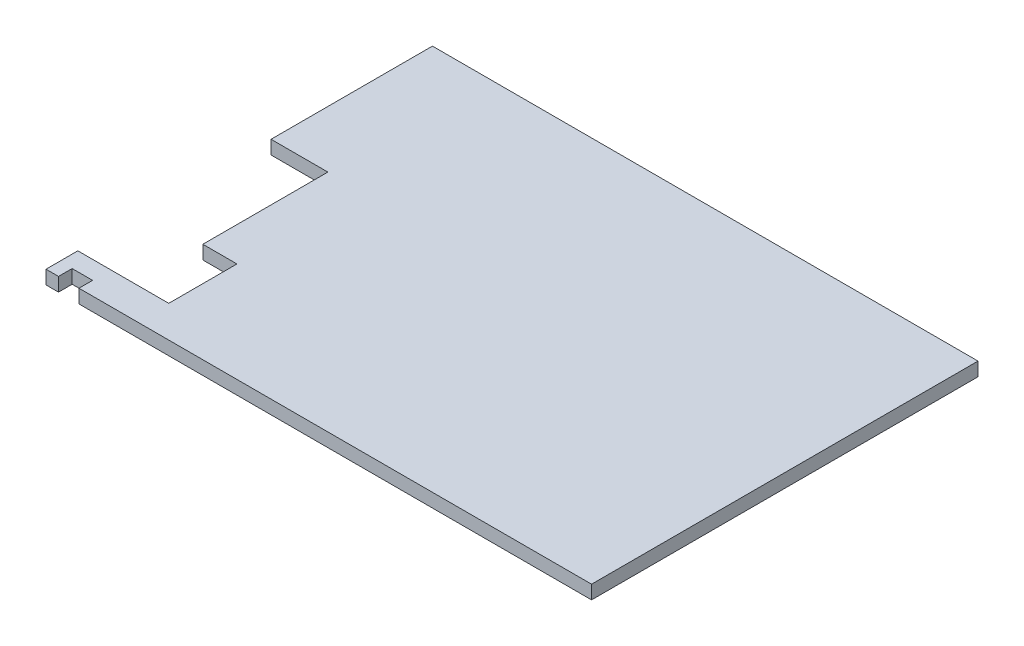
ISO-10303-21;
HEADER;
FILE_DESCRIPTION(('STEP AP214'),'2;1');
FILE_NAME('part.step','',(''),(''),'','','');
FILE_SCHEMA(('AUTOMOTIVE_DESIGN { 1 0 10303 214 1 1 1 1 }'));
ENDSEC;
DATA;
#1=APPLICATION_CONTEXT('core data for automotive mechanical design processes');
#2=APPLICATION_PROTOCOL_DEFINITION('international standard','automotive_design',2000,#1);
#3=PRODUCT_CONTEXT('',#1,'mechanical');
#4=PRODUCT('Part','Part','',(#3));
#5=PRODUCT_RELATED_PRODUCT_CATEGORY('part','',(#4));
#6=PRODUCT_DEFINITION_FORMATION('','',#4);
#7=PRODUCT_DEFINITION_CONTEXT('part definition',#1,'design');
#8=PRODUCT_DEFINITION('design','',#6,#7);
#9=PRODUCT_DEFINITION_SHAPE('','',#8);
#10=(LENGTH_UNIT() NAMED_UNIT(*) SI_UNIT(.MILLI.,.METRE.));
#11=(NAMED_UNIT(*) PLANE_ANGLE_UNIT() SI_UNIT($,.RADIAN.));
#12=(NAMED_UNIT(*) SI_UNIT($,.STERADIAN.) SOLID_ANGLE_UNIT());
#13=UNCERTAINTY_MEASURE_WITH_UNIT(LENGTH_MEASURE(1.E-05),#10,'distance_accuracy_value','');
#14=(GEOMETRIC_REPRESENTATION_CONTEXT(3) GLOBAL_UNCERTAINTY_ASSIGNED_CONTEXT((#13)) GLOBAL_UNIT_ASSIGNED_CONTEXT((#10,
#11,#12)) REPRESENTATION_CONTEXT('',''));
#15=CARTESIAN_POINT('',(0.,0.,0.));
#16=DIRECTION('',(0.,0.,1.));
#17=DIRECTION('',(1.,0.,0.));
#18=AXIS2_PLACEMENT_3D('',#15,#16,#17);
#19=CARTESIAN_POINT('',(40.,6.,-18.7966927474291));
#20=DIRECTION('',(1.,0.,0.));
#21=DIRECTION('',(0.,0.,-1.));
#22=AXIS2_PLACEMENT_3D('',#19,#20,#21);
#23=PLANE('',#22);
#24=DIRECTION('',(0.,0.,1.));
#25=VECTOR('',#24,1.);
#26=CARTESIAN_POINT('',(40.,0.,-18.7966927474291));
#27=LINE('',#26,#25);
#28=CARTESIAN_POINT('',(40.,0.,-48.7966927474291));
#29=VERTEX_POINT('',#28);
#30=CARTESIAN_POINT('',(40.,0.,-18.7966927474291));
#31=VERTEX_POINT('',#30);
#32=EDGE_CURVE('E165',#29,#31,#27,.T.);
#33=ORIENTED_EDGE('',*,*,#32,.T.);
#34=DIRECTION('',(0.,-1.,0.));
#35=VECTOR('',#34,1.);
#36=CARTESIAN_POINT('',(40.,6.,-18.7966927474291));
#37=LINE('',#36,#35);
#38=CARTESIAN_POINT('',(40.,6.,-18.7966927474291));
#39=VERTEX_POINT('',#38);
#40=EDGE_CURVE('E11',#39,#31,#37,.T.);
#41=ORIENTED_EDGE('',*,*,#40,.F.);
#42=DIRECTION('',(0.,0.,1.));
#43=VECTOR('',#42,1.);
#44=CARTESIAN_POINT('',(40.,6.,-18.7966927474291));
#45=LINE('',#44,#43);
#46=CARTESIAN_POINT('',(40.,6.,-48.7966927474291));
#47=VERTEX_POINT('',#46);
#48=EDGE_CURVE('E191',#47,#39,#45,.T.);
#49=ORIENTED_EDGE('',*,*,#48,.F.);
#50=DIRECTION('',(0.,-1.,0.));
#51=VECTOR('',#50,1.);
#52=CARTESIAN_POINT('',(40.,6.,-48.7966927474291));
#53=LINE('',#52,#51);
#54=EDGE_CURVE('E161',#47,#29,#53,.T.);
#55=ORIENTED_EDGE('',*,*,#54,.T.);
#56=EDGE_LOOP('',(#33,#41,#49,#55));
#57=FACE_BOUND('',#56,.T.);
#58=ADVANCED_FACE('F33',(#57),#23,.F.);
#59=CARTESIAN_POINT('',(0.,6.,-18.7966927474291));
#60=DIRECTION('',(0.,0.,1.));
#61=DIRECTION('',(1.,0.,0.));
#62=AXIS2_PLACEMENT_3D('',#59,#60,#61);
#63=PLANE('',#62);
#64=DIRECTION('',(-1.,0.,0.));
#65=VECTOR('',#64,1.);
#66=CARTESIAN_POINT('',(0.,0.,-18.7966927474291));
#67=LINE('',#66,#65);
#68=CARTESIAN_POINT('',(0.,0.,-18.7966927474291));
#69=VERTEX_POINT('',#68);
#70=EDGE_CURVE('E168',#31,#69,#67,.T.);
#71=ORIENTED_EDGE('',*,*,#70,.T.);
#72=DIRECTION('',(0.,-1.,0.));
#73=VECTOR('',#72,1.);
#74=CARTESIAN_POINT('',(0.,6.,-18.7966927474291));
#75=LINE('',#74,#73);
#76=CARTESIAN_POINT('',(0.,6.,-18.7966927474291));
#77=VERTEX_POINT('',#76);
#78=EDGE_CURVE('E41',#77,#69,#75,.T.);
#79=ORIENTED_EDGE('',*,*,#78,.F.);
#80=DIRECTION('',(-1.,0.,0.));
#81=VECTOR('',#80,1.);
#82=CARTESIAN_POINT('',(25.,6.,-18.7966927474291));
#83=LINE('',#82,#81);
#84=EDGE_CURVE('E110',#39,#77,#83,.T.);
#85=ORIENTED_EDGE('',*,*,#84,.F.);
#86=ORIENTED_EDGE('',*,*,#40,.T.);
#87=EDGE_LOOP('',(#71,#79,#85,#86));
#88=FACE_BOUND('',#87,.T.);
#89=ADVANCED_FACE('F279',(#88),#63,.F.);
#90=CARTESIAN_POINT('',(0.,6.,-4.79669274742912));
#91=DIRECTION('',(1.,0.,0.));
#92=DIRECTION('',(0.,0.,-1.));
#93=AXIS2_PLACEMENT_3D('',#90,#91,#92);
#94=PLANE('',#93);
#95=DIRECTION('',(0.,0.,1.));
#96=VECTOR('',#95,1.);
#97=CARTESIAN_POINT('',(0.,0.,-4.79669274742912));
#98=LINE('',#97,#96);
#99=CARTESIAN_POINT('',(0.,0.,-4.79669274742912));
#100=VERTEX_POINT('',#99);
#101=EDGE_CURVE('E170',#69,#100,#98,.T.);
#102=ORIENTED_EDGE('',*,*,#101,.T.);
#103=DIRECTION('',(0.,-1.,0.));
#104=VECTOR('',#103,1.);
#105=CARTESIAN_POINT('',(0.,6.,-4.79669274742912));
#106=LINE('',#105,#104);
#107=CARTESIAN_POINT('',(0.,6.,-4.79669274742912));
#108=VERTEX_POINT('',#107);
#109=EDGE_CURVE('E216',#108,#100,#106,.T.);
#110=ORIENTED_EDGE('',*,*,#109,.F.);
#111=DIRECTION('',(0.,0.,1.));
#112=VECTOR('',#111,1.);
#113=CARTESIAN_POINT('',(0.,6.,-4.79669274742912));
#114=LINE('',#113,#112);
#115=EDGE_CURVE('E224',#77,#108,#114,.T.);
#116=ORIENTED_EDGE('',*,*,#115,.F.);
#117=ORIENTED_EDGE('',*,*,#78,.T.);
#118=EDGE_LOOP('',(#102,#110,#116,#117));
#119=FACE_BOUND('',#118,.T.);
#120=ADVANCED_FACE('F222',(#119),#94,.F.);
#121=CARTESIAN_POINT('',(0.,6.,-4.79669274742912));
#122=DIRECTION('',(0.,0.,-1.));
#123=DIRECTION('',(-1.,0.,0.));
#124=AXIS2_PLACEMENT_3D('',#121,#122,#123);
#125=PLANE('',#124);
#126=DIRECTION('',(1.,0.,0.));
#127=VECTOR('',#126,1.);
#128=CARTESIAN_POINT('',(0.,0.,-4.79669274742912));
#129=LINE('',#128,#127);
#130=CARTESIAN_POINT('',(5.50000000000002,0.,-4.79669274742912));
#131=VERTEX_POINT('',#130);
#132=EDGE_CURVE('E172',#100,#131,#129,.T.);
#133=ORIENTED_EDGE('',*,*,#132,.T.);
#134=DIRECTION('',(0.,-1.,0.));
#135=VECTOR('',#134,1.);
#136=CARTESIAN_POINT('',(5.50000000000002,6.,-4.79669274742912));
#137=LINE('',#136,#135);
#138=CARTESIAN_POINT('',(5.50000000000002,6.,-4.79669274742912));
#139=VERTEX_POINT('',#138);
#140=EDGE_CURVE('E213',#139,#131,#137,.T.);
#141=ORIENTED_EDGE('',*,*,#140,.F.);
#142=DIRECTION('',(1.,0.,0.));
#143=VECTOR('',#142,1.);
#144=CARTESIAN_POINT('',(0.,6.,-4.79669274742912));
#145=LINE('',#144,#143);
#146=EDGE_CURVE('E242',#108,#139,#145,.T.);
#147=ORIENTED_EDGE('',*,*,#146,.F.);
#148=ORIENTED_EDGE('',*,*,#109,.T.);
#149=EDGE_LOOP('',(#133,#141,#147,#148));
#150=FACE_BOUND('',#149,.T.);
#151=ADVANCED_FACE('F233',(#150),#125,.F.);
#152=CARTESIAN_POINT('',(5.50000000000002,6.,-4.79669274742912));
#153=DIRECTION('',(-1.,0.,0.));
#154=DIRECTION('',(0.,0.,1.));
#155=AXIS2_PLACEMENT_3D('',#152,#153,#154);
#156=PLANE('',#155);
#157=DIRECTION('',(0.,0.,-1.));
#158=VECTOR('',#157,1.);
#159=CARTESIAN_POINT('',(5.50000000000002,0.,-4.79669274742912));
#160=LINE('',#159,#158);
#161=CARTESIAN_POINT('',(5.50000000000002,0.,-10.7966927474291));
#162=VERTEX_POINT('',#161);
#163=EDGE_CURVE('E174',#131,#162,#160,.T.);
#164=ORIENTED_EDGE('',*,*,#163,.T.);
#165=DIRECTION('',(0.,-1.,0.));
#166=VECTOR('',#165,1.);
#167=CARTESIAN_POINT('',(5.50000000000002,6.,-10.7966927474291));
#168=LINE('',#167,#166);
#169=CARTESIAN_POINT('',(5.50000000000002,6.,-10.7966927474291));
#170=VERTEX_POINT('',#169);
#171=EDGE_CURVE('E210',#170,#162,#168,.T.);
#172=ORIENTED_EDGE('',*,*,#171,.F.);
#173=DIRECTION('',(0.,0.,-1.));
#174=VECTOR('',#173,1.);
#175=CARTESIAN_POINT('',(5.50000000000002,6.,-4.79669274742912));
#176=LINE('',#175,#174);
#177=EDGE_CURVE('E239',#139,#170,#176,.T.);
#178=ORIENTED_EDGE('',*,*,#177,.F.);
#179=ORIENTED_EDGE('',*,*,#140,.T.);
#180=EDGE_LOOP('',(#164,#172,#178,#179));
#181=FACE_BOUND('',#180,.T.);
#182=ADVANCED_FACE('F237',(#181),#156,.F.);
#183=CARTESIAN_POINT('',(5.50000000000002,6.,-10.7966927474291));
#184=DIRECTION('',(0.,0.,-1.));
#185=DIRECTION('',(-1.,0.,0.));
#186=AXIS2_PLACEMENT_3D('',#183,#184,#185);
#187=PLANE('',#186);
#188=DIRECTION('',(1.,0.,0.));
#189=VECTOR('',#188,1.);
#190=CARTESIAN_POINT('',(5.50000000000002,0.,-10.7966927474291));
#191=LINE('',#190,#189);
#192=CARTESIAN_POINT('',(14.5,0.,-10.7966927474291));
#193=VERTEX_POINT('',#192);
#194=EDGE_CURVE('E176',#162,#193,#191,.T.);
#195=ORIENTED_EDGE('',*,*,#194,.T.);
#196=DIRECTION('',(0.,-1.,0.));
#197=VECTOR('',#196,1.);
#198=CARTESIAN_POINT('',(14.5,6.,-10.7966927474291));
#199=LINE('',#198,#197);
#200=CARTESIAN_POINT('',(14.5,6.,-10.7966927474291));
#201=VERTEX_POINT('',#200);
#202=EDGE_CURVE('E207',#201,#193,#199,.T.);
#203=ORIENTED_EDGE('',*,*,#202,.F.);
#204=DIRECTION('',(1.,0.,0.));
#205=VECTOR('',#204,1.);
#206=CARTESIAN_POINT('',(5.50000000000002,6.,-10.7966927474291));
#207=LINE('',#206,#205);
#208=EDGE_CURVE('E241',#170,#201,#207,.T.);
#209=ORIENTED_EDGE('',*,*,#208,.F.);
#210=ORIENTED_EDGE('',*,*,#171,.T.);
#211=EDGE_LOOP('',(#195,#203,#209,#210));
#212=FACE_BOUND('',#211,.T.);
#213=ADVANCED_FACE('F292',(#212),#187,.F.);
#214=CARTESIAN_POINT('',(14.5,6.,-4.79669274742912));
#215=DIRECTION('',(1.,0.,0.));
#216=DIRECTION('',(0.,0.,-1.));
#217=AXIS2_PLACEMENT_3D('',#214,#215,#216);
#218=PLANE('',#217);
#219=DIRECTION('',(0.,0.,1.));
#220=VECTOR('',#219,1.);
#221=CARTESIAN_POINT('',(14.5,0.,-4.79669274742912));
#222=LINE('',#221,#220);
#223=CARTESIAN_POINT('',(14.5,0.,-4.79669274742912));
#224=VERTEX_POINT('',#223);
#225=EDGE_CURVE('E178',#193,#224,#222,.T.);
#226=ORIENTED_EDGE('',*,*,#225,.T.);
#227=DIRECTION('',(0.,-1.,0.));
#228=VECTOR('',#227,1.);
#229=CARTESIAN_POINT('',(14.5,6.,-4.79669274742912));
#230=LINE('',#229,#228);
#231=CARTESIAN_POINT('',(14.5,6.,-4.79669274742912));
#232=VERTEX_POINT('',#231);
#233=EDGE_CURVE('E204',#232,#224,#230,.T.);
#234=ORIENTED_EDGE('',*,*,#233,.F.);
#235=DIRECTION('',(0.,0.,1.));
#236=VECTOR('',#235,1.);
#237=CARTESIAN_POINT('',(14.5,6.,-4.79669274742912));
#238=LINE('',#237,#236);
#239=EDGE_CURVE('E244',#201,#232,#238,.T.);
#240=ORIENTED_EDGE('',*,*,#239,.F.);
#241=ORIENTED_EDGE('',*,*,#202,.T.);
#242=EDGE_LOOP('',(#226,#234,#240,#241));
#243=FACE_BOUND('',#242,.T.);
#244=ADVANCED_FACE('F295',(#243),#218,.F.);
#245=CARTESIAN_POINT('',(14.5,6.,-4.79669274742912));
#246=DIRECTION('',(0.,0.,-1.));
#247=DIRECTION('',(-1.,0.,0.));
#248=AXIS2_PLACEMENT_3D('',#245,#246,#247);
#249=PLANE('',#248);
#250=DIRECTION('',(1.,0.,0.));
#251=VECTOR('',#250,1.);
#252=CARTESIAN_POINT('',(14.5,0.,-4.79669274742912));
#253=LINE('',#252,#251);
#254=CARTESIAN_POINT('',(240.,0.,-4.79669274742912));
#255=VERTEX_POINT('',#254);
#256=EDGE_CURVE('E180',#224,#255,#253,.T.);
#257=ORIENTED_EDGE('',*,*,#256,.T.);
#258=DIRECTION('',(0.,-1.,0.));
#259=VECTOR('',#258,1.);
#260=CARTESIAN_POINT('',(240.,6.,-4.79669274742912));
#261=LINE('',#260,#259);
#262=CARTESIAN_POINT('',(240.,6.,-4.79669274742912));
#263=VERTEX_POINT('',#262);
#264=EDGE_CURVE('E201',#263,#255,#261,.T.);
#265=ORIENTED_EDGE('',*,*,#264,.F.);
#266=DIRECTION('',(1.,0.,0.));
#267=VECTOR('',#266,1.);
#268=CARTESIAN_POINT('',(14.5,6.,-4.79669274742912));
#269=LINE('',#268,#267);
#270=EDGE_CURVE('E250',#232,#263,#269,.T.);
#271=ORIENTED_EDGE('',*,*,#270,.F.);
#272=ORIENTED_EDGE('',*,*,#233,.T.);
#273=EDGE_LOOP('',(#257,#265,#271,#272));
#274=FACE_BOUND('',#273,.T.);
#275=ADVANCED_FACE('F299',(#274),#249,.F.);
#276=CARTESIAN_POINT('',(240.,6.,-4.79669274742912));
#277=DIRECTION('',(-1.,0.,0.));
#278=DIRECTION('',(0.,0.,1.));
#279=AXIS2_PLACEMENT_3D('',#276,#277,#278);
#280=PLANE('',#279);
#281=DIRECTION('',(0.,0.,-1.));
#282=VECTOR('',#281,1.);
#283=CARTESIAN_POINT('',(240.,0.,-4.79669274742912));
#284=LINE('',#283,#282);
#285=CARTESIAN_POINT('',(240.,0.,-174.796692747429));
#286=VERTEX_POINT('',#285);
#287=EDGE_CURVE('E182',#255,#286,#284,.T.);
#288=ORIENTED_EDGE('',*,*,#287,.T.);
#289=DIRECTION('',(0.,-1.,0.));
#290=VECTOR('',#289,1.);
#291=CARTESIAN_POINT('',(240.,6.,-174.796692747429));
#292=LINE('',#291,#290);
#293=CARTESIAN_POINT('',(240.,6.,-174.796692747429));
#294=VERTEX_POINT('',#293);
#295=EDGE_CURVE('E198',#294,#286,#292,.T.);
#296=ORIENTED_EDGE('',*,*,#295,.F.);
#297=DIRECTION('',(0.,0.,-1.));
#298=VECTOR('',#297,1.);
#299=CARTESIAN_POINT('',(240.,6.,-4.79669274742912));
#300=LINE('',#299,#298);
#301=EDGE_CURVE('E252',#263,#294,#300,.T.);
#302=ORIENTED_EDGE('',*,*,#301,.F.);
#303=ORIENTED_EDGE('',*,*,#264,.T.);
#304=EDGE_LOOP('',(#288,#296,#302,#303));
#305=FACE_BOUND('',#304,.T.);
#306=ADVANCED_FACE('F303',(#305),#280,.F.);
#307=CARTESIAN_POINT('',(0.,6.,-174.796692747429));
#308=DIRECTION('',(0.,0.,1.));
#309=DIRECTION('',(1.,0.,0.));
#310=AXIS2_PLACEMENT_3D('',#307,#308,#309);
#311=PLANE('',#310);
#312=DIRECTION('',(-1.,0.,0.));
#313=VECTOR('',#312,1.);
#314=CARTESIAN_POINT('',(0.,0.,-174.796692747429));
#315=LINE('',#314,#313);
#316=CARTESIAN_POINT('',(0.,0.,-174.796692747429));
#317=VERTEX_POINT('',#316);
#318=EDGE_CURVE('E184',#286,#317,#315,.T.);
#319=ORIENTED_EDGE('',*,*,#318,.T.);
#320=DIRECTION('',(0.,-1.,0.));
#321=VECTOR('',#320,1.);
#322=CARTESIAN_POINT('',(0.,6.,-174.796692747429));
#323=LINE('',#322,#321);
#324=CARTESIAN_POINT('',(0.,6.,-174.796692747429));
#325=VERTEX_POINT('',#324);
#326=EDGE_CURVE('E195',#325,#317,#323,.T.);
#327=ORIENTED_EDGE('',*,*,#326,.F.);
#328=DIRECTION('',(-1.,0.,0.));
#329=VECTOR('',#328,1.);
#330=CARTESIAN_POINT('',(0.,6.,-174.796692747429));
#331=LINE('',#330,#329);
#332=EDGE_CURVE('E254',#294,#325,#331,.T.);
#333=ORIENTED_EDGE('',*,*,#332,.F.);
#334=ORIENTED_EDGE('',*,*,#295,.T.);
#335=EDGE_LOOP('',(#319,#327,#333,#334));
#336=FACE_BOUND('',#335,.T.);
#337=ADVANCED_FACE('F260',(#336),#311,.F.);
#338=CARTESIAN_POINT('',(0.,6.,-103.796692747429));
#339=DIRECTION('',(1.,0.,0.));
#340=DIRECTION('',(0.,0.,-1.));
#341=AXIS2_PLACEMENT_3D('',#338,#339,#340);
#342=PLANE('',#341);
#343=DIRECTION('',(0.,0.,1.));
#344=VECTOR('',#343,1.);
#345=CARTESIAN_POINT('',(0.,0.,-103.796692747429));
#346=LINE('',#345,#344);
#347=CARTESIAN_POINT('',(0.,0.,-103.796692747429));
#348=VERTEX_POINT('',#347);
#349=EDGE_CURVE('E186',#317,#348,#346,.T.);
#350=ORIENTED_EDGE('',*,*,#349,.T.);
#351=DIRECTION('',(0.,-1.,0.));
#352=VECTOR('',#351,1.);
#353=CARTESIAN_POINT('',(0.,6.,-103.796692747429));
#354=LINE('',#353,#352);
#355=CARTESIAN_POINT('',(0.,6.,-103.796692747429));
#356=VERTEX_POINT('',#355);
#357=EDGE_CURVE('E156',#356,#348,#354,.T.);
#358=ORIENTED_EDGE('',*,*,#357,.F.);
#359=DIRECTION('',(0.,0.,1.));
#360=VECTOR('',#359,1.);
#361=CARTESIAN_POINT('',(0.,6.,-103.796692747429));
#362=LINE('',#361,#360);
#363=EDGE_CURVE('E147',#325,#356,#362,.T.);
#364=ORIENTED_EDGE('',*,*,#363,.F.);
#365=ORIENTED_EDGE('',*,*,#326,.T.);
#366=EDGE_LOOP('',(#350,#358,#364,#365));
#367=FACE_BOUND('',#366,.T.);
#368=ADVANCED_FACE('F264',(#367),#342,.F.);
#369=CARTESIAN_POINT('',(25.,6.,-103.796692747429));
#370=DIRECTION('',(0.,0.,-1.));
#371=DIRECTION('',(-1.,0.,0.));
#372=AXIS2_PLACEMENT_3D('',#369,#370,#371);
#373=PLANE('',#372);
#374=DIRECTION('',(1.,0.,0.));
#375=VECTOR('',#374,1.);
#376=CARTESIAN_POINT('',(25.,0.,-103.796692747429));
#377=LINE('',#376,#375);
#378=CARTESIAN_POINT('',(25.,0.,-103.796692747429));
#379=VERTEX_POINT('',#378);
#380=EDGE_CURVE('E155',#348,#379,#377,.T.);
#381=ORIENTED_EDGE('',*,*,#380,.T.);
#382=DIRECTION('',(0.,-1.,0.));
#383=VECTOR('',#382,1.);
#384=CARTESIAN_POINT('',(25.,6.,-103.796692747429));
#385=LINE('',#384,#383);
#386=CARTESIAN_POINT('',(25.,6.,-103.796692747429));
#387=VERTEX_POINT('',#386);
#388=EDGE_CURVE('E152',#387,#379,#385,.T.);
#389=ORIENTED_EDGE('',*,*,#388,.F.);
#390=DIRECTION('',(1.,0.,0.));
#391=VECTOR('',#390,1.);
#392=CARTESIAN_POINT('',(25.,6.,-103.796692747429));
#393=LINE('',#392,#391);
#394=EDGE_CURVE('E141',#356,#387,#393,.T.);
#395=ORIENTED_EDGE('',*,*,#394,.F.);
#396=ORIENTED_EDGE('',*,*,#357,.T.);
#397=EDGE_LOOP('',(#381,#389,#395,#396));
#398=FACE_BOUND('',#397,.T.);
#399=ADVANCED_FACE('F153',(#398),#373,.F.);
#400=CARTESIAN_POINT('',(25.,6.,-48.7966927474291));
#401=DIRECTION('',(1.,0.,0.));
#402=DIRECTION('',(0.,0.,-1.));
#403=AXIS2_PLACEMENT_3D('',#400,#401,#402);
#404=PLANE('',#403);
#405=DIRECTION('',(0.,0.,1.));
#406=VECTOR('',#405,1.);
#407=CARTESIAN_POINT('',(25.,0.,-48.7966927474291));
#408=LINE('',#407,#406);
#409=CARTESIAN_POINT('',(25.,0.,-48.7966927474291));
#410=VERTEX_POINT('',#409);
#411=EDGE_CURVE('E96',#379,#410,#408,.T.);
#412=ORIENTED_EDGE('',*,*,#411,.T.);
#413=DIRECTION('',(0.,-1.,0.));
#414=VECTOR('',#413,1.);
#415=CARTESIAN_POINT('',(25.,6.,-48.7966927474291));
#416=LINE('',#415,#414);
#417=CARTESIAN_POINT('',(25.,6.,-48.7966927474291));
#418=VERTEX_POINT('',#417);
#419=EDGE_CURVE('E157',#418,#410,#416,.T.);
#420=ORIENTED_EDGE('',*,*,#419,.F.);
#421=DIRECTION('',(0.,0.,1.));
#422=VECTOR('',#421,1.);
#423=CARTESIAN_POINT('',(25.,6.,-48.7966927474291));
#424=LINE('',#423,#422);
#425=EDGE_CURVE('E145',#387,#418,#424,.T.);
#426=ORIENTED_EDGE('',*,*,#425,.F.);
#427=ORIENTED_EDGE('',*,*,#388,.T.);
#428=EDGE_LOOP('',(#412,#420,#426,#427));
#429=FACE_BOUND('',#428,.T.);
#430=ADVANCED_FACE('F159',(#429),#404,.F.);
#431=CARTESIAN_POINT('',(40.,6.,-48.7966927474291));
#432=DIRECTION('',(0.,0.,-1.));
#433=DIRECTION('',(-1.,0.,0.));
#434=AXIS2_PLACEMENT_3D('',#431,#432,#433);
#435=PLANE('',#434);
#436=DIRECTION('',(1.,0.,0.));
#437=VECTOR('',#436,1.);
#438=CARTESIAN_POINT('',(40.,0.,-48.7966927474291));
#439=LINE('',#438,#437);
#440=EDGE_CURVE('E102',#410,#29,#439,.T.);
#441=ORIENTED_EDGE('',*,*,#440,.T.);
#442=ORIENTED_EDGE('',*,*,#54,.F.);
#443=DIRECTION('',(1.,0.,0.));
#444=VECTOR('',#443,1.);
#445=CARTESIAN_POINT('',(40.,6.,-48.7966927474291));
#446=LINE('',#445,#444);
#447=EDGE_CURVE('E49',#418,#47,#446,.T.);
#448=ORIENTED_EDGE('',*,*,#447,.F.);
#449=ORIENTED_EDGE('',*,*,#419,.T.);
#450=EDGE_LOOP('',(#441,#442,#448,#449));
#451=FACE_BOUND('',#450,.T.);
#452=ADVANCED_FACE('F268',(#451),#435,.F.);
#453=CARTESIAN_POINT('',(0.,6.,0.));
#454=DIRECTION('',(0.,1.,0.));
#455=DIRECTION('',(0.,0.,1.));
#456=AXIS2_PLACEMENT_3D('',#453,#454,#455);
#457=PLANE('',#456);
#458=ORIENTED_EDGE('',*,*,#48,.T.);
#459=ORIENTED_EDGE('',*,*,#84,.T.);
#460=ORIENTED_EDGE('',*,*,#115,.T.);
#461=ORIENTED_EDGE('',*,*,#146,.T.);
#462=ORIENTED_EDGE('',*,*,#177,.T.);
#463=ORIENTED_EDGE('',*,*,#208,.T.);
#464=ORIENTED_EDGE('',*,*,#239,.T.);
#465=ORIENTED_EDGE('',*,*,#270,.T.);
#466=ORIENTED_EDGE('',*,*,#301,.T.);
#467=ORIENTED_EDGE('',*,*,#332,.T.);
#468=ORIENTED_EDGE('',*,*,#363,.T.);
#469=ORIENTED_EDGE('',*,*,#394,.T.);
#470=ORIENTED_EDGE('',*,*,#425,.T.);
#471=ORIENTED_EDGE('',*,*,#447,.T.);
#472=EDGE_LOOP('',(#458,#459,#460,#461,#462,#463,#464,#465,#466,#467,#468,#469,#470,#471));
#473=FACE_BOUND('',#472,.T.);
#474=ADVANCED_FACE('F143',(#473),#457,.T.);
#475=CARTESIAN_POINT('',(0.,0.,0.));
#476=DIRECTION('',(0.,1.,0.));
#477=DIRECTION('',(0.,0.,1.));
#478=AXIS2_PLACEMENT_3D('',#475,#476,#477);
#479=PLANE('',#478);
#480=ORIENTED_EDGE('',*,*,#32,.F.);
#481=ORIENTED_EDGE('',*,*,#440,.F.);
#482=ORIENTED_EDGE('',*,*,#411,.F.);
#483=ORIENTED_EDGE('',*,*,#380,.F.);
#484=ORIENTED_EDGE('',*,*,#349,.F.);
#485=ORIENTED_EDGE('',*,*,#318,.F.);
#486=ORIENTED_EDGE('',*,*,#287,.F.);
#487=ORIENTED_EDGE('',*,*,#256,.F.);
#488=ORIENTED_EDGE('',*,*,#225,.F.);
#489=ORIENTED_EDGE('',*,*,#194,.F.);
#490=ORIENTED_EDGE('',*,*,#163,.F.);
#491=ORIENTED_EDGE('',*,*,#132,.F.);
#492=ORIENTED_EDGE('',*,*,#101,.F.);
#493=ORIENTED_EDGE('',*,*,#70,.F.);
#494=EDGE_LOOP('',(#480,#481,#482,#483,#484,#485,#486,#487,#488,#489,#490,#491,#492,#493));
#495=FACE_BOUND('',#494,.T.);
#496=ADVANCED_FACE('F228',(#495),#479,.F.);
#497=CLOSED_SHELL('',(#58,#89,#120,#151,#182,#213,#244,#275,#306,#337,#368,#399,#430,#452,#474,#496));
#498=MANIFOLD_SOLID_BREP('B2',#497);
#499=ADVANCED_BREP_SHAPE_REPRESENTATION('',(#18,#498),#14);
#500=SHAPE_DEFINITION_REPRESENTATION(#9,#499);
ENDSEC;
END-ISO-10303-21;
